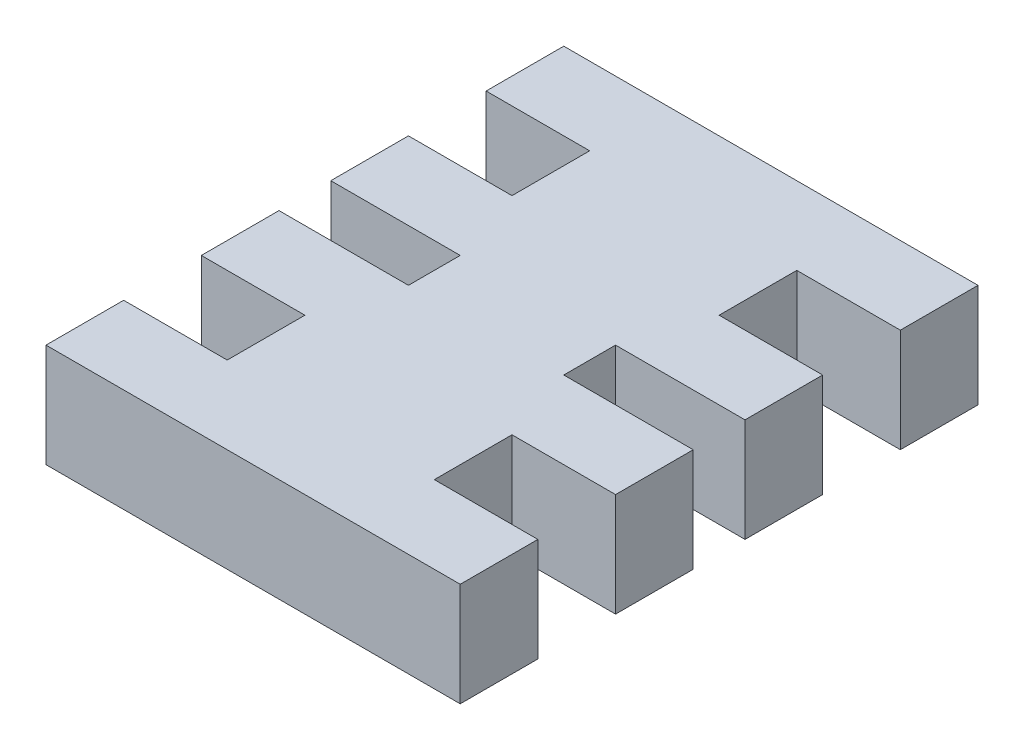
ISO-10303-21;
HEADER;
FILE_DESCRIPTION(('STEP AP214'),'2;1');
FILE_NAME('part.step','',(''),(''),'','','');
FILE_SCHEMA(('AUTOMOTIVE_DESIGN { 1 0 10303 214 1 1 1 1 }'));
ENDSEC;
DATA;
#1=APPLICATION_CONTEXT('core data for automotive mechanical design processes');
#2=APPLICATION_PROTOCOL_DEFINITION('international standard','automotive_design',2000,#1);
#3=PRODUCT_CONTEXT('',#1,'mechanical');
#4=PRODUCT('Part','Part','',(#3));
#5=PRODUCT_RELATED_PRODUCT_CATEGORY('part','',(#4));
#6=PRODUCT_DEFINITION_FORMATION('','',#4);
#7=PRODUCT_DEFINITION_CONTEXT('part definition',#1,'design');
#8=PRODUCT_DEFINITION('design','',#6,#7);
#9=PRODUCT_DEFINITION_SHAPE('','',#8);
#10=(LENGTH_UNIT() NAMED_UNIT(*) SI_UNIT(.MILLI.,.METRE.));
#11=(NAMED_UNIT(*) PLANE_ANGLE_UNIT() SI_UNIT($,.RADIAN.));
#12=(NAMED_UNIT(*) SI_UNIT($,.STERADIAN.) SOLID_ANGLE_UNIT());
#13=UNCERTAINTY_MEASURE_WITH_UNIT(LENGTH_MEASURE(1.E-05),#10,'distance_accuracy_value','');
#14=(GEOMETRIC_REPRESENTATION_CONTEXT(3) GLOBAL_UNCERTAINTY_ASSIGNED_CONTEXT((#13)) GLOBAL_UNIT_ASSIGNED_CONTEXT((#10,
#11,#12)) REPRESENTATION_CONTEXT('',''));
#15=CARTESIAN_POINT('',(0.,0.,0.));
#16=DIRECTION('',(0.,0.,1.));
#17=DIRECTION('',(1.,0.,0.));
#18=AXIS2_PLACEMENT_3D('',#15,#16,#17);
#19=CARTESIAN_POINT('',(40.,20.,35.));
#20=DIRECTION('',(-1.,0.,0.));
#21=DIRECTION('',(0.,0.,1.));
#22=AXIS2_PLACEMENT_3D('',#19,#20,#21);
#23=PLANE('',#22);
#24=DIRECTION('',(0.,0.,-1.));
#25=VECTOR('',#24,1.);
#26=CARTESIAN_POINT('',(40.,0.,35.));
#27=LINE('',#26,#25);
#28=CARTESIAN_POINT('',(40.,0.,50.));
#29=VERTEX_POINT('',#28);
#30=CARTESIAN_POINT('',(40.,0.,35.));
#31=VERTEX_POINT('',#30);
#32=EDGE_CURVE('E260',#29,#31,#27,.T.);
#33=ORIENTED_EDGE('',*,*,#32,.T.);
#34=DIRECTION('',(0.,-1.,0.));
#35=VECTOR('',#34,1.);
#36=CARTESIAN_POINT('',(40.,20.,35.));
#37=LINE('',#36,#35);
#38=CARTESIAN_POINT('',(40.,20.,35.));
#39=VERTEX_POINT('',#38);
#40=EDGE_CURVE('E11',#39,#31,#37,.T.);
#41=ORIENTED_EDGE('',*,*,#40,.F.);
#42=DIRECTION('',(0.,0.,-1.));
#43=VECTOR('',#42,1.);
#44=CARTESIAN_POINT('',(40.,20.,35.));
#45=LINE('',#44,#43);
#46=CARTESIAN_POINT('',(40.,20.,50.));
#47=VERTEX_POINT('',#46);
#48=EDGE_CURVE('E342',#47,#39,#45,.T.);
#49=ORIENTED_EDGE('',*,*,#48,.F.);
#50=DIRECTION('',(0.,-1.,0.));
#51=VECTOR('',#50,1.);
#52=CARTESIAN_POINT('',(40.,20.,50.));
#53=LINE('',#52,#51);
#54=EDGE_CURVE('E256',#47,#29,#53,.T.);
#55=ORIENTED_EDGE('',*,*,#54,.T.);
#56=EDGE_LOOP('',(#33,#41,#49,#55));
#57=FACE_BOUND('',#56,.T.);
#58=ADVANCED_FACE('F39',(#57),#23,.F.);
#59=CARTESIAN_POINT('',(40.,20.,35.));
#60=DIRECTION('',(0.,0.,1.));
#61=DIRECTION('',(1.,0.,0.));
#62=AXIS2_PLACEMENT_3D('',#59,#60,#61);
#63=PLANE('',#62);
#64=DIRECTION('',(-1.,0.,0.));
#65=VECTOR('',#64,1.);
#66=CARTESIAN_POINT('',(40.,0.,35.));
#67=LINE('',#66,#65);
#68=CARTESIAN_POINT('',(20.,0.,35.));
#69=VERTEX_POINT('',#68);
#70=EDGE_CURVE('E264',#31,#69,#67,.T.);
#71=ORIENTED_EDGE('',*,*,#70,.T.);
#72=DIRECTION('',(0.,-1.,0.));
#73=VECTOR('',#72,1.);
#74=CARTESIAN_POINT('',(20.,20.,35.));
#75=LINE('',#74,#73);
#76=CARTESIAN_POINT('',(20.,20.,35.));
#77=VERTEX_POINT('',#76);
#78=EDGE_CURVE('E48',#77,#69,#75,.T.);
#79=ORIENTED_EDGE('',*,*,#78,.F.);
#80=DIRECTION('',(-1.,0.,0.));
#81=VECTOR('',#80,1.);
#82=CARTESIAN_POINT('',(40.,20.,35.));
#83=LINE('',#82,#81);
#84=EDGE_CURVE('E159',#39,#77,#83,.T.);
#85=ORIENTED_EDGE('',*,*,#84,.F.);
#86=ORIENTED_EDGE('',*,*,#40,.T.);
#87=EDGE_LOOP('',(#71,#79,#85,#86));
#88=FACE_BOUND('',#87,.T.);
#89=ADVANCED_FACE('F548',(#88),#63,.F.);
#90=CARTESIAN_POINT('',(20.,20.,35.));
#91=DIRECTION('',(-1.,0.,0.));
#92=DIRECTION('',(0.,0.,1.));
#93=AXIS2_PLACEMENT_3D('',#90,#91,#92);
#94=PLANE('',#93);
#95=DIRECTION('',(0.,0.,-1.));
#96=VECTOR('',#95,1.);
#97=CARTESIAN_POINT('',(20.,0.,35.));
#98=LINE('',#97,#96);
#99=CARTESIAN_POINT('',(20.,0.,20.));
#100=VERTEX_POINT('',#99);
#101=EDGE_CURVE('E267',#69,#100,#98,.T.);
#102=ORIENTED_EDGE('',*,*,#101,.T.);
#103=DIRECTION('',(0.,-1.,0.));
#104=VECTOR('',#103,1.);
#105=CARTESIAN_POINT('',(20.,20.,20.));
#106=LINE('',#105,#104);
#107=CARTESIAN_POINT('',(20.,20.,20.));
#108=VERTEX_POINT('',#107);
#109=EDGE_CURVE('E433',#108,#100,#106,.T.);
#110=ORIENTED_EDGE('',*,*,#109,.F.);
#111=DIRECTION('',(0.,0.,-1.));
#112=VECTOR('',#111,1.);
#113=CARTESIAN_POINT('',(20.,20.,35.));
#114=LINE('',#113,#112);
#115=EDGE_CURVE('E443',#77,#108,#114,.T.);
#116=ORIENTED_EDGE('',*,*,#115,.F.);
#117=ORIENTED_EDGE('',*,*,#78,.T.);
#118=EDGE_LOOP('',(#102,#110,#116,#117));
#119=FACE_BOUND('',#118,.T.);
#120=ADVANCED_FACE('F441',(#119),#94,.F.);
#121=CARTESIAN_POINT('',(40.,20.,20.));
#122=DIRECTION('',(0.,0.,-1.));
#123=DIRECTION('',(-1.,0.,0.));
#124=AXIS2_PLACEMENT_3D('',#121,#122,#123);
#125=PLANE('',#124);
#126=DIRECTION('',(1.,0.,0.));
#127=VECTOR('',#126,1.);
#128=CARTESIAN_POINT('',(40.,0.,20.));
#129=LINE('',#128,#127);
#130=CARTESIAN_POINT('',(40.,0.,20.));
#131=VERTEX_POINT('',#130);
#132=EDGE_CURVE('E270',#100,#131,#129,.T.);
#133=ORIENTED_EDGE('',*,*,#132,.T.);
#134=DIRECTION('',(0.,-1.,0.));
#135=VECTOR('',#134,1.);
#136=CARTESIAN_POINT('',(40.,20.,20.));
#137=LINE('',#136,#135);
#138=CARTESIAN_POINT('',(40.,20.,20.));
#139=VERTEX_POINT('',#138);
#140=EDGE_CURVE('E429',#139,#131,#137,.T.);
#141=ORIENTED_EDGE('',*,*,#140,.F.);
#142=DIRECTION('',(1.,0.,0.));
#143=VECTOR('',#142,1.);
#144=CARTESIAN_POINT('',(40.,20.,20.));
#145=LINE('',#144,#143);
#146=EDGE_CURVE('E462',#108,#139,#145,.T.);
#147=ORIENTED_EDGE('',*,*,#146,.F.);
#148=ORIENTED_EDGE('',*,*,#109,.T.);
#149=EDGE_LOOP('',(#133,#141,#147,#148));
#150=FACE_BOUND('',#149,.T.);
#151=ADVANCED_FACE('F452',(#150),#125,.F.);
#152=CARTESIAN_POINT('',(40.,20.,5.00000000000002));
#153=DIRECTION('',(-1.,0.,0.));
#154=DIRECTION('',(0.,0.,1.));
#155=AXIS2_PLACEMENT_3D('',#152,#153,#154);
#156=PLANE('',#155);
#157=DIRECTION('',(0.,0.,-1.));
#158=VECTOR('',#157,1.);
#159=CARTESIAN_POINT('',(40.,0.,5.00000000000002));
#160=LINE('',#159,#158);
#161=CARTESIAN_POINT('',(40.,0.,5.00000000000002));
#162=VERTEX_POINT('',#161);
#163=EDGE_CURVE('E273',#131,#162,#160,.T.);
#164=ORIENTED_EDGE('',*,*,#163,.T.);
#165=DIRECTION('',(0.,-1.,0.));
#166=VECTOR('',#165,1.);
#167=CARTESIAN_POINT('',(40.,20.,5.00000000000002));
#168=LINE('',#167,#166);
#169=CARTESIAN_POINT('',(40.,20.,5.00000000000002));
#170=VERTEX_POINT('',#169);
#171=EDGE_CURVE('E425',#170,#162,#168,.T.);
#172=ORIENTED_EDGE('',*,*,#171,.F.);
#173=DIRECTION('',(0.,0.,-1.));
#174=VECTOR('',#173,1.);
#175=CARTESIAN_POINT('',(40.,20.,5.00000000000002));
#176=LINE('',#175,#174);
#177=EDGE_CURVE('E458',#139,#170,#176,.T.);
#178=ORIENTED_EDGE('',*,*,#177,.F.);
#179=ORIENTED_EDGE('',*,*,#140,.T.);
#180=EDGE_LOOP('',(#164,#172,#178,#179));
#181=FACE_BOUND('',#180,.T.);
#182=ADVANCED_FACE('F456',(#181),#156,.F.);
#183=CARTESIAN_POINT('',(40.,20.,5.00000000000002));
#184=DIRECTION('',(0.,0.,1.));
#185=DIRECTION('',(1.,0.,0.));
#186=AXIS2_PLACEMENT_3D('',#183,#184,#185);
#187=PLANE('',#186);
#188=DIRECTION('',(-1.,0.,0.));
#189=VECTOR('',#188,1.);
#190=CARTESIAN_POINT('',(40.,0.,5.00000000000002));
#191=LINE('',#190,#189);
#192=CARTESIAN_POINT('',(15.,0.,5.00000000000002));
#193=VERTEX_POINT('',#192);
#194=EDGE_CURVE('E276',#162,#193,#191,.T.);
#195=ORIENTED_EDGE('',*,*,#194,.T.);
#196=DIRECTION('',(0.,-1.,0.));
#197=VECTOR('',#196,1.);
#198=CARTESIAN_POINT('',(15.,20.,5.00000000000002));
#199=LINE('',#198,#197);
#200=CARTESIAN_POINT('',(15.,20.,5.00000000000002));
#201=VERTEX_POINT('',#200);
#202=EDGE_CURVE('E421',#201,#193,#199,.T.);
#203=ORIENTED_EDGE('',*,*,#202,.F.);
#204=DIRECTION('',(-1.,0.,0.));
#205=VECTOR('',#204,1.);
#206=CARTESIAN_POINT('',(40.,20.,5.00000000000002));
#207=LINE('',#206,#205);
#208=EDGE_CURVE('E461',#170,#201,#207,.T.);
#209=ORIENTED_EDGE('',*,*,#208,.F.);
#210=ORIENTED_EDGE('',*,*,#171,.T.);
#211=EDGE_LOOP('',(#195,#203,#209,#210));
#212=FACE_BOUND('',#211,.T.);
#213=ADVANCED_FACE('F561',(#212),#187,.F.);
#214=CARTESIAN_POINT('',(15.,20.,-4.99999999999998));
#215=DIRECTION('',(-1.,0.,0.));
#216=DIRECTION('',(0.,0.,1.));
#217=AXIS2_PLACEMENT_3D('',#214,#215,#216);
#218=PLANE('',#217);
#219=DIRECTION('',(0.,0.,-1.));
#220=VECTOR('',#219,1.);
#221=CARTESIAN_POINT('',(15.,0.,-4.99999999999998));
#222=LINE('',#221,#220);
#223=CARTESIAN_POINT('',(15.,0.,-4.99999999999998));
#224=VERTEX_POINT('',#223);
#225=EDGE_CURVE('E279',#193,#224,#222,.T.);
#226=ORIENTED_EDGE('',*,*,#225,.T.);
#227=DIRECTION('',(0.,-1.,0.));
#228=VECTOR('',#227,1.);
#229=CARTESIAN_POINT('',(15.,20.,-4.99999999999998));
#230=LINE('',#229,#228);
#231=CARTESIAN_POINT('',(15.,20.,-4.99999999999998));
#232=VERTEX_POINT('',#231);
#233=EDGE_CURVE('E417',#232,#224,#230,.T.);
#234=ORIENTED_EDGE('',*,*,#233,.F.);
#235=DIRECTION('',(0.,0.,-1.));
#236=VECTOR('',#235,1.);
#237=CARTESIAN_POINT('',(15.,20.,-4.99999999999998));
#238=LINE('',#237,#236);
#239=EDGE_CURVE('E466',#201,#232,#238,.T.);
#240=ORIENTED_EDGE('',*,*,#239,.F.);
#241=ORIENTED_EDGE('',*,*,#202,.T.);
#242=EDGE_LOOP('',(#226,#234,#240,#241));
#243=FACE_BOUND('',#242,.T.);
#244=ADVANCED_FACE('F564',(#243),#218,.F.);
#245=CARTESIAN_POINT('',(40.,20.,-4.99999999999998));
#246=DIRECTION('',(0.,0.,-1.));
#247=DIRECTION('',(-1.,0.,0.));
#248=AXIS2_PLACEMENT_3D('',#245,#246,#247);
#249=PLANE('',#248);
#250=DIRECTION('',(1.,0.,0.));
#251=VECTOR('',#250,1.);
#252=CARTESIAN_POINT('',(40.,0.,-4.99999999999998));
#253=LINE('',#252,#251);
#254=CARTESIAN_POINT('',(40.,0.,-4.99999999999998));
#255=VERTEX_POINT('',#254);
#256=EDGE_CURVE('E282',#224,#255,#253,.T.);
#257=ORIENTED_EDGE('',*,*,#256,.T.);
#258=DIRECTION('',(0.,-1.,0.));
#259=VECTOR('',#258,1.);
#260=CARTESIAN_POINT('',(40.,20.,-4.99999999999998));
#261=LINE('',#260,#259);
#262=CARTESIAN_POINT('',(40.,20.,-4.99999999999998));
#263=VERTEX_POINT('',#262);
#264=EDGE_CURVE('E413',#263,#255,#261,.T.);
#265=ORIENTED_EDGE('',*,*,#264,.F.);
#266=DIRECTION('',(1.,0.,0.));
#267=VECTOR('',#266,1.);
#268=CARTESIAN_POINT('',(40.,20.,-4.99999999999998));
#269=LINE('',#268,#267);
#270=EDGE_CURVE('E473',#232,#263,#269,.T.);
#271=ORIENTED_EDGE('',*,*,#270,.F.);
#272=ORIENTED_EDGE('',*,*,#233,.T.);
#273=EDGE_LOOP('',(#257,#265,#271,#272));
#274=FACE_BOUND('',#273,.T.);
#275=ADVANCED_FACE('F568',(#274),#249,.F.);
#276=CARTESIAN_POINT('',(40.,20.,-20.));
#277=DIRECTION('',(-1.,0.,0.));
#278=DIRECTION('',(0.,0.,1.));
#279=AXIS2_PLACEMENT_3D('',#276,#277,#278);
#280=PLANE('',#279);
#281=DIRECTION('',(0.,0.,-1.));
#282=VECTOR('',#281,1.);
#283=CARTESIAN_POINT('',(40.,0.,-20.));
#284=LINE('',#283,#282);
#285=CARTESIAN_POINT('',(40.,0.,-20.));
#286=VERTEX_POINT('',#285);
#287=EDGE_CURVE('E285',#255,#286,#284,.T.);
#288=ORIENTED_EDGE('',*,*,#287,.T.);
#289=DIRECTION('',(0.,-1.,0.));
#290=VECTOR('',#289,1.);
#291=CARTESIAN_POINT('',(40.,20.,-20.));
#292=LINE('',#291,#290);
#293=CARTESIAN_POINT('',(40.,20.,-20.));
#294=VERTEX_POINT('',#293);
#295=EDGE_CURVE('E409',#294,#286,#292,.T.);
#296=ORIENTED_EDGE('',*,*,#295,.F.);
#297=DIRECTION('',(0.,0.,-1.));
#298=VECTOR('',#297,1.);
#299=CARTESIAN_POINT('',(40.,20.,-20.));
#300=LINE('',#299,#298);
#301=EDGE_CURVE('E476',#263,#294,#300,.T.);
#302=ORIENTED_EDGE('',*,*,#301,.F.);
#303=ORIENTED_EDGE('',*,*,#264,.T.);
#304=EDGE_LOOP('',(#288,#296,#302,#303));
#305=FACE_BOUND('',#304,.T.);
#306=ADVANCED_FACE('F572',(#305),#280,.F.);
#307=CARTESIAN_POINT('',(40.,20.,-20.));
#308=DIRECTION('',(0.,0.,1.));
#309=DIRECTION('',(1.,0.,0.));
#310=AXIS2_PLACEMENT_3D('',#307,#308,#309);
#311=PLANE('',#310);
#312=DIRECTION('',(-1.,0.,0.));
#313=VECTOR('',#312,1.);
#314=CARTESIAN_POINT('',(40.,0.,-20.));
#315=LINE('',#314,#313);
#316=CARTESIAN_POINT('',(20.,0.,-20.));
#317=VERTEX_POINT('',#316);
#318=EDGE_CURVE('E288',#286,#317,#315,.T.);
#319=ORIENTED_EDGE('',*,*,#318,.T.);
#320=DIRECTION('',(0.,-1.,0.));
#321=VECTOR('',#320,1.);
#322=CARTESIAN_POINT('',(20.,20.,-20.));
#323=LINE('',#322,#321);
#324=CARTESIAN_POINT('',(20.,20.,-20.));
#325=VERTEX_POINT('',#324);
#326=EDGE_CURVE('E405',#325,#317,#323,.T.);
#327=ORIENTED_EDGE('',*,*,#326,.F.);
#328=DIRECTION('',(-1.,0.,0.));
#329=VECTOR('',#328,1.);
#330=CARTESIAN_POINT('',(40.,20.,-20.));
#331=LINE('',#330,#329);
#332=EDGE_CURVE('E479',#294,#325,#331,.T.);
#333=ORIENTED_EDGE('',*,*,#332,.F.);
#334=ORIENTED_EDGE('',*,*,#295,.T.);
#335=EDGE_LOOP('',(#319,#327,#333,#334));
#336=FACE_BOUND('',#335,.T.);
#337=ADVANCED_FACE('F576',(#336),#311,.F.);
#338=CARTESIAN_POINT('',(20.,20.,-35.));
#339=DIRECTION('',(-1.,0.,0.));
#340=DIRECTION('',(0.,0.,1.));
#341=AXIS2_PLACEMENT_3D('',#338,#339,#340);
#342=PLANE('',#341);
#343=DIRECTION('',(0.,0.,-1.));
#344=VECTOR('',#343,1.);
#345=CARTESIAN_POINT('',(20.,0.,-35.));
#346=LINE('',#345,#344);
#347=CARTESIAN_POINT('',(20.,0.,-35.));
#348=VERTEX_POINT('',#347);
#349=EDGE_CURVE('E291',#317,#348,#346,.T.);
#350=ORIENTED_EDGE('',*,*,#349,.T.);
#351=DIRECTION('',(0.,-1.,0.));
#352=VECTOR('',#351,1.);
#353=CARTESIAN_POINT('',(20.,20.,-35.));
#354=LINE('',#353,#352);
#355=CARTESIAN_POINT('',(20.,20.,-35.));
#356=VERTEX_POINT('',#355);
#357=EDGE_CURVE('E401',#356,#348,#354,.T.);
#358=ORIENTED_EDGE('',*,*,#357,.F.);
#359=DIRECTION('',(0.,0.,-1.));
#360=VECTOR('',#359,1.);
#361=CARTESIAN_POINT('',(20.,20.,-35.));
#362=LINE('',#361,#360);
#363=EDGE_CURVE('E482',#325,#356,#362,.T.);
#364=ORIENTED_EDGE('',*,*,#363,.F.);
#365=ORIENTED_EDGE('',*,*,#326,.T.);
#366=EDGE_LOOP('',(#350,#358,#364,#365));
#367=FACE_BOUND('',#366,.T.);
#368=ADVANCED_FACE('F580',(#367),#342,.F.);
#369=CARTESIAN_POINT('',(40.,20.,-35.));
#370=DIRECTION('',(0.,0.,-1.));
#371=DIRECTION('',(-1.,0.,0.));
#372=AXIS2_PLACEMENT_3D('',#369,#370,#371);
#373=PLANE('',#372);
#374=DIRECTION('',(1.,0.,0.));
#375=VECTOR('',#374,1.);
#376=CARTESIAN_POINT('',(40.,0.,-35.));
#377=LINE('',#376,#375);
#378=CARTESIAN_POINT('',(40.,0.,-35.));
#379=VERTEX_POINT('',#378);
#380=EDGE_CURVE('E294',#348,#379,#377,.T.);
#381=ORIENTED_EDGE('',*,*,#380,.T.);
#382=DIRECTION('',(0.,-1.,0.));
#383=VECTOR('',#382,1.);
#384=CARTESIAN_POINT('',(40.,20.,-35.));
#385=LINE('',#384,#383);
#386=CARTESIAN_POINT('',(40.,20.,-35.));
#387=VERTEX_POINT('',#386);
#388=EDGE_CURVE('E397',#387,#379,#385,.T.);
#389=ORIENTED_EDGE('',*,*,#388,.F.);
#390=DIRECTION('',(1.,0.,0.));
#391=VECTOR('',#390,1.);
#392=CARTESIAN_POINT('',(40.,20.,-35.));
#393=LINE('',#392,#391);
#394=EDGE_CURVE('E485',#356,#387,#393,.T.);
#395=ORIENTED_EDGE('',*,*,#394,.F.);
#396=ORIENTED_EDGE('',*,*,#357,.T.);
#397=EDGE_LOOP('',(#381,#389,#395,#396));
#398=FACE_BOUND('',#397,.T.);
#399=ADVANCED_FACE('F584',(#398),#373,.F.);
#400=CARTESIAN_POINT('',(40.,20.,-50.));
#401=DIRECTION('',(-1.,0.,0.));
#402=DIRECTION('',(0.,0.,1.));
#403=AXIS2_PLACEMENT_3D('',#400,#401,#402);
#404=PLANE('',#403);
#405=DIRECTION('',(0.,0.,-1.));
#406=VECTOR('',#405,1.);
#407=CARTESIAN_POINT('',(40.,0.,-50.));
#408=LINE('',#407,#406);
#409=CARTESIAN_POINT('',(40.,0.,-50.));
#410=VERTEX_POINT('',#409);
#411=EDGE_CURVE('E297',#379,#410,#408,.T.);
#412=ORIENTED_EDGE('',*,*,#411,.T.);
#413=DIRECTION('',(0.,-1.,0.));
#414=VECTOR('',#413,1.);
#415=CARTESIAN_POINT('',(40.,20.,-50.));
#416=LINE('',#415,#414);
#417=CARTESIAN_POINT('',(40.,20.,-50.));
#418=VERTEX_POINT('',#417);
#419=EDGE_CURVE('E393',#418,#410,#416,.T.);
#420=ORIENTED_EDGE('',*,*,#419,.F.);
#421=DIRECTION('',(0.,0.,-1.));
#422=VECTOR('',#421,1.);
#423=CARTESIAN_POINT('',(40.,20.,-50.));
#424=LINE('',#423,#422);
#425=EDGE_CURVE('E488',#387,#418,#424,.T.);
#426=ORIENTED_EDGE('',*,*,#425,.F.);
#427=ORIENTED_EDGE('',*,*,#388,.T.);
#428=EDGE_LOOP('',(#412,#420,#426,#427));
#429=FACE_BOUND('',#428,.T.);
#430=ADVANCED_FACE('F588',(#429),#404,.F.);
#431=CARTESIAN_POINT('',(-40.,20.,-50.));
#432=DIRECTION('',(0.,0.,1.));
#433=DIRECTION('',(1.,0.,0.));
#434=AXIS2_PLACEMENT_3D('',#431,#432,#433);
#435=PLANE('',#434);
#436=DIRECTION('',(-1.,0.,0.));
#437=VECTOR('',#436,1.);
#438=CARTESIAN_POINT('',(-40.,0.,-50.));
#439=LINE('',#438,#437);
#440=CARTESIAN_POINT('',(-40.,0.,-50.));
#441=VERTEX_POINT('',#440);
#442=EDGE_CURVE('E300',#410,#441,#439,.T.);
#443=ORIENTED_EDGE('',*,*,#442,.T.);
#444=DIRECTION('',(0.,-1.,0.));
#445=VECTOR('',#444,1.);
#446=CARTESIAN_POINT('',(-40.,20.,-50.));
#447=LINE('',#446,#445);
#448=CARTESIAN_POINT('',(-40.,20.,-50.));
#449=VERTEX_POINT('',#448);
#450=EDGE_CURVE('E389',#449,#441,#447,.T.);
#451=ORIENTED_EDGE('',*,*,#450,.F.);
#452=DIRECTION('',(-1.,0.,0.));
#453=VECTOR('',#452,1.);
#454=CARTESIAN_POINT('',(-40.,20.,-50.));
#455=LINE('',#454,#453);
#456=EDGE_CURVE('E491',#418,#449,#455,.T.);
#457=ORIENTED_EDGE('',*,*,#456,.F.);
#458=ORIENTED_EDGE('',*,*,#419,.T.);
#459=EDGE_LOOP('',(#443,#451,#457,#458));
#460=FACE_BOUND('',#459,.T.);
#461=ADVANCED_FACE('F592',(#460),#435,.F.);
#462=CARTESIAN_POINT('',(-40.,20.,-50.));
#463=DIRECTION('',(1.,0.,0.));
#464=DIRECTION('',(0.,0.,-1.));
#465=AXIS2_PLACEMENT_3D('',#462,#463,#464);
#466=PLANE('',#465);
#467=DIRECTION('',(0.,0.,1.));
#468=VECTOR('',#467,1.);
#469=CARTESIAN_POINT('',(-40.,0.,-50.));
#470=LINE('',#469,#468);
#471=CARTESIAN_POINT('',(-40.,0.,-35.));
#472=VERTEX_POINT('',#471);
#473=EDGE_CURVE('E303',#441,#472,#470,.T.);
#474=ORIENTED_EDGE('',*,*,#473,.T.);
#475=DIRECTION('',(0.,-1.,0.));
#476=VECTOR('',#475,1.);
#477=CARTESIAN_POINT('',(-40.,20.,-35.));
#478=LINE('',#477,#476);
#479=CARTESIAN_POINT('',(-40.,20.,-35.));
#480=VERTEX_POINT('',#479);
#481=EDGE_CURVE('E385',#480,#472,#478,.T.);
#482=ORIENTED_EDGE('',*,*,#481,.F.);
#483=DIRECTION('',(0.,0.,1.));
#484=VECTOR('',#483,1.);
#485=CARTESIAN_POINT('',(-40.,20.,-50.));
#486=LINE('',#485,#484);
#487=EDGE_CURVE('E494',#449,#480,#486,.T.);
#488=ORIENTED_EDGE('',*,*,#487,.F.);
#489=ORIENTED_EDGE('',*,*,#450,.T.);
#490=EDGE_LOOP('',(#474,#482,#488,#489));
#491=FACE_BOUND('',#490,.T.);
#492=ADVANCED_FACE('F596',(#491),#466,.F.);
#493=CARTESIAN_POINT('',(-40.,20.,-35.));
#494=DIRECTION('',(0.,0.,-1.));
#495=DIRECTION('',(-1.,0.,0.));
#496=AXIS2_PLACEMENT_3D('',#493,#494,#495);
#497=PLANE('',#496);
#498=DIRECTION('',(1.,0.,0.));
#499=VECTOR('',#498,1.);
#500=CARTESIAN_POINT('',(-40.,0.,-35.));
#501=LINE('',#500,#499);
#502=CARTESIAN_POINT('',(-20.,0.,-35.));
#503=VERTEX_POINT('',#502);
#504=EDGE_CURVE('E306',#472,#503,#501,.T.);
#505=ORIENTED_EDGE('',*,*,#504,.T.);
#506=DIRECTION('',(0.,-1.,0.));
#507=VECTOR('',#506,1.);
#508=CARTESIAN_POINT('',(-20.,20.,-35.));
#509=LINE('',#508,#507);
#510=CARTESIAN_POINT('',(-20.,20.,-35.));
#511=VERTEX_POINT('',#510);
#512=EDGE_CURVE('E381',#511,#503,#509,.T.);
#513=ORIENTED_EDGE('',*,*,#512,.F.);
#514=DIRECTION('',(1.,0.,0.));
#515=VECTOR('',#514,1.);
#516=CARTESIAN_POINT('',(-40.,20.,-35.));
#517=LINE('',#516,#515);
#518=EDGE_CURVE('E497',#480,#511,#517,.T.);
#519=ORIENTED_EDGE('',*,*,#518,.F.);
#520=ORIENTED_EDGE('',*,*,#481,.T.);
#521=EDGE_LOOP('',(#505,#513,#519,#520));
#522=FACE_BOUND('',#521,.T.);
#523=ADVANCED_FACE('F600',(#522),#497,.F.);
#524=CARTESIAN_POINT('',(-20.,20.,-35.));
#525=DIRECTION('',(1.,0.,0.));
#526=DIRECTION('',(0.,0.,-1.));
#527=AXIS2_PLACEMENT_3D('',#524,#525,#526);
#528=PLANE('',#527);
#529=DIRECTION('',(0.,0.,1.));
#530=VECTOR('',#529,1.);
#531=CARTESIAN_POINT('',(-20.,0.,-35.));
#532=LINE('',#531,#530);
#533=CARTESIAN_POINT('',(-20.,0.,-20.));
#534=VERTEX_POINT('',#533);
#535=EDGE_CURVE('E309',#503,#534,#532,.T.);
#536=ORIENTED_EDGE('',*,*,#535,.T.);
#537=DIRECTION('',(0.,-1.,0.));
#538=VECTOR('',#537,1.);
#539=CARTESIAN_POINT('',(-20.,20.,-20.));
#540=LINE('',#539,#538);
#541=CARTESIAN_POINT('',(-20.,20.,-20.));
#542=VERTEX_POINT('',#541);
#543=EDGE_CURVE('E377',#542,#534,#540,.T.);
#544=ORIENTED_EDGE('',*,*,#543,.F.);
#545=DIRECTION('',(0.,0.,1.));
#546=VECTOR('',#545,1.);
#547=CARTESIAN_POINT('',(-20.,20.,-35.));
#548=LINE('',#547,#546);
#549=EDGE_CURVE('E500',#511,#542,#548,.T.);
#550=ORIENTED_EDGE('',*,*,#549,.F.);
#551=ORIENTED_EDGE('',*,*,#512,.T.);
#552=EDGE_LOOP('',(#536,#544,#550,#551));
#553=FACE_BOUND('',#552,.T.);
#554=ADVANCED_FACE('F604',(#553),#528,.F.);
#555=CARTESIAN_POINT('',(-40.,20.,-20.));
#556=DIRECTION('',(0.,0.,1.));
#557=DIRECTION('',(1.,0.,0.));
#558=AXIS2_PLACEMENT_3D('',#555,#556,#557);
#559=PLANE('',#558);
#560=DIRECTION('',(-1.,0.,0.));
#561=VECTOR('',#560,1.);
#562=CARTESIAN_POINT('',(-40.,0.,-20.));
#563=LINE('',#562,#561);
#564=CARTESIAN_POINT('',(-40.,0.,-20.));
#565=VERTEX_POINT('',#564);
#566=EDGE_CURVE('E312',#534,#565,#563,.T.);
#567=ORIENTED_EDGE('',*,*,#566,.T.);
#568=DIRECTION('',(0.,-1.,0.));
#569=VECTOR('',#568,1.);
#570=CARTESIAN_POINT('',(-40.,20.,-20.));
#571=LINE('',#570,#569);
#572=CARTESIAN_POINT('',(-40.,20.,-20.));
#573=VERTEX_POINT('',#572);
#574=EDGE_CURVE('E373',#573,#565,#571,.T.);
#575=ORIENTED_EDGE('',*,*,#574,.F.);
#576=DIRECTION('',(-1.,0.,0.));
#577=VECTOR('',#576,1.);
#578=CARTESIAN_POINT('',(-40.,20.,-20.));
#579=LINE('',#578,#577);
#580=EDGE_CURVE('E503',#542,#573,#579,.T.);
#581=ORIENTED_EDGE('',*,*,#580,.F.);
#582=ORIENTED_EDGE('',*,*,#543,.T.);
#583=EDGE_LOOP('',(#567,#575,#581,#582));
#584=FACE_BOUND('',#583,.T.);
#585=ADVANCED_FACE('F608',(#584),#559,.F.);
#586=CARTESIAN_POINT('',(-40.,20.,-20.));
#587=DIRECTION('',(1.,0.,0.));
#588=DIRECTION('',(0.,0.,-1.));
#589=AXIS2_PLACEMENT_3D('',#586,#587,#588);
#590=PLANE('',#589);
#591=DIRECTION('',(0.,0.,1.));
#592=VECTOR('',#591,1.);
#593=CARTESIAN_POINT('',(-40.,0.,-20.));
#594=LINE('',#593,#592);
#595=CARTESIAN_POINT('',(-40.,0.,-4.99999999999998));
#596=VERTEX_POINT('',#595);
#597=EDGE_CURVE('E315',#565,#596,#594,.T.);
#598=ORIENTED_EDGE('',*,*,#597,.T.);
#599=DIRECTION('',(0.,-1.,0.));
#600=VECTOR('',#599,1.);
#601=CARTESIAN_POINT('',(-40.,20.,-4.99999999999998));
#602=LINE('',#601,#600);
#603=CARTESIAN_POINT('',(-40.,20.,-4.99999999999998));
#604=VERTEX_POINT('',#603);
#605=EDGE_CURVE('E369',#604,#596,#602,.T.);
#606=ORIENTED_EDGE('',*,*,#605,.F.);
#607=DIRECTION('',(0.,0.,1.));
#608=VECTOR('',#607,1.);
#609=CARTESIAN_POINT('',(-40.,20.,-20.));
#610=LINE('',#609,#608);
#611=EDGE_CURVE('E506',#573,#604,#610,.T.);
#612=ORIENTED_EDGE('',*,*,#611,.F.);
#613=ORIENTED_EDGE('',*,*,#574,.T.);
#614=EDGE_LOOP('',(#598,#606,#612,#613));
#615=FACE_BOUND('',#614,.T.);
#616=ADVANCED_FACE('F612',(#615),#590,.F.);
#617=CARTESIAN_POINT('',(-40.,20.,-4.99999999999998));
#618=DIRECTION('',(0.,0.,-1.));
#619=DIRECTION('',(-1.,0.,0.));
#620=AXIS2_PLACEMENT_3D('',#617,#618,#619);
#621=PLANE('',#620);
#622=DIRECTION('',(1.,0.,0.));
#623=VECTOR('',#622,1.);
#624=CARTESIAN_POINT('',(-40.,0.,-4.99999999999998));
#625=LINE('',#624,#623);
#626=CARTESIAN_POINT('',(-15.,0.,-4.99999999999998));
#627=VERTEX_POINT('',#626);
#628=EDGE_CURVE('E318',#596,#627,#625,.T.);
#629=ORIENTED_EDGE('',*,*,#628,.T.);
#630=DIRECTION('',(0.,-1.,0.));
#631=VECTOR('',#630,1.);
#632=CARTESIAN_POINT('',(-15.,20.,-4.99999999999998));
#633=LINE('',#632,#631);
#634=CARTESIAN_POINT('',(-15.,20.,-4.99999999999998));
#635=VERTEX_POINT('',#634);
#636=EDGE_CURVE('E365',#635,#627,#633,.T.);
#637=ORIENTED_EDGE('',*,*,#636,.F.);
#638=DIRECTION('',(1.,0.,0.));
#639=VECTOR('',#638,1.);
#640=CARTESIAN_POINT('',(-40.,20.,-4.99999999999998));
#641=LINE('',#640,#639);
#642=EDGE_CURVE('E509',#604,#635,#641,.T.);
#643=ORIENTED_EDGE('',*,*,#642,.F.);
#644=ORIENTED_EDGE('',*,*,#605,.T.);
#645=EDGE_LOOP('',(#629,#637,#643,#644));
#646=FACE_BOUND('',#645,.T.);
#647=ADVANCED_FACE('F616',(#646),#621,.F.);
#648=CARTESIAN_POINT('',(-15.,20.,-4.99999999999998));
#649=DIRECTION('',(1.,0.,0.));
#650=DIRECTION('',(0.,0.,-1.));
#651=AXIS2_PLACEMENT_3D('',#648,#649,#650);
#652=PLANE('',#651);
#653=DIRECTION('',(0.,0.,1.));
#654=VECTOR('',#653,1.);
#655=CARTESIAN_POINT('',(-15.,0.,-4.99999999999998));
#656=LINE('',#655,#654);
#657=CARTESIAN_POINT('',(-15.,0.,5.00000000000002));
#658=VERTEX_POINT('',#657);
#659=EDGE_CURVE('E321',#627,#658,#656,.T.);
#660=ORIENTED_EDGE('',*,*,#659,.T.);
#661=DIRECTION('',(0.,-1.,0.));
#662=VECTOR('',#661,1.);
#663=CARTESIAN_POINT('',(-15.,20.,5.00000000000002));
#664=LINE('',#663,#662);
#665=CARTESIAN_POINT('',(-15.,20.,5.00000000000002));
#666=VERTEX_POINT('',#665);
#667=EDGE_CURVE('E361',#666,#658,#664,.T.);
#668=ORIENTED_EDGE('',*,*,#667,.F.);
#669=DIRECTION('',(0.,0.,1.));
#670=VECTOR('',#669,1.);
#671=CARTESIAN_POINT('',(-15.,20.,-4.99999999999998));
#672=LINE('',#671,#670);
#673=EDGE_CURVE('E512',#635,#666,#672,.T.);
#674=ORIENTED_EDGE('',*,*,#673,.F.);
#675=ORIENTED_EDGE('',*,*,#636,.T.);
#676=EDGE_LOOP('',(#660,#668,#674,#675));
#677=FACE_BOUND('',#676,.T.);
#678=ADVANCED_FACE('F620',(#677),#652,.F.);
#679=CARTESIAN_POINT('',(-40.,20.,5.00000000000002));
#680=DIRECTION('',(0.,0.,1.));
#681=DIRECTION('',(1.,0.,0.));
#682=AXIS2_PLACEMENT_3D('',#679,#680,#681);
#683=PLANE('',#682);
#684=DIRECTION('',(-1.,0.,0.));
#685=VECTOR('',#684,1.);
#686=CARTESIAN_POINT('',(-40.,0.,5.00000000000002));
#687=LINE('',#686,#685);
#688=CARTESIAN_POINT('',(-40.,0.,5.00000000000002));
#689=VERTEX_POINT('',#688);
#690=EDGE_CURVE('E324',#658,#689,#687,.T.);
#691=ORIENTED_EDGE('',*,*,#690,.T.);
#692=DIRECTION('',(0.,-1.,0.));
#693=VECTOR('',#692,1.);
#694=CARTESIAN_POINT('',(-40.,20.,5.00000000000002));
#695=LINE('',#694,#693);
#696=CARTESIAN_POINT('',(-40.,20.,5.00000000000002));
#697=VERTEX_POINT('',#696);
#698=EDGE_CURVE('E357',#697,#689,#695,.T.);
#699=ORIENTED_EDGE('',*,*,#698,.F.);
#700=DIRECTION('',(-1.,0.,0.));
#701=VECTOR('',#700,1.);
#702=CARTESIAN_POINT('',(-40.,20.,5.00000000000002));
#703=LINE('',#702,#701);
#704=EDGE_CURVE('E515',#666,#697,#703,.T.);
#705=ORIENTED_EDGE('',*,*,#704,.F.);
#706=ORIENTED_EDGE('',*,*,#667,.T.);
#707=EDGE_LOOP('',(#691,#699,#705,#706));
#708=FACE_BOUND('',#707,.T.);
#709=ADVANCED_FACE('F624',(#708),#683,.F.);
#710=CARTESIAN_POINT('',(-40.,20.,5.00000000000002));
#711=DIRECTION('',(1.,0.,0.));
#712=DIRECTION('',(0.,0.,-1.));
#713=AXIS2_PLACEMENT_3D('',#710,#711,#712);
#714=PLANE('',#713);
#715=DIRECTION('',(0.,0.,1.));
#716=VECTOR('',#715,1.);
#717=CARTESIAN_POINT('',(-40.,0.,5.00000000000002));
#718=LINE('',#717,#716);
#719=CARTESIAN_POINT('',(-40.,0.,20.));
#720=VERTEX_POINT('',#719);
#721=EDGE_CURVE('E327',#689,#720,#718,.T.);
#722=ORIENTED_EDGE('',*,*,#721,.T.);
#723=DIRECTION('',(0.,-1.,0.));
#724=VECTOR('',#723,1.);
#725=CARTESIAN_POINT('',(-40.,20.,20.));
#726=LINE('',#725,#724);
#727=CARTESIAN_POINT('',(-40.,20.,20.));
#728=VERTEX_POINT('',#727);
#729=EDGE_CURVE('E353',#728,#720,#726,.T.);
#730=ORIENTED_EDGE('',*,*,#729,.F.);
#731=DIRECTION('',(0.,0.,1.));
#732=VECTOR('',#731,1.);
#733=CARTESIAN_POINT('',(-40.,20.,5.00000000000002));
#734=LINE('',#733,#732);
#735=EDGE_CURVE('E518',#697,#728,#734,.T.);
#736=ORIENTED_EDGE('',*,*,#735,.F.);
#737=ORIENTED_EDGE('',*,*,#698,.T.);
#738=EDGE_LOOP('',(#722,#730,#736,#737));
#739=FACE_BOUND('',#738,.T.);
#740=ADVANCED_FACE('F628',(#739),#714,.F.);
#741=CARTESIAN_POINT('',(-40.,20.,20.));
#742=DIRECTION('',(0.,0.,-1.));
#743=DIRECTION('',(-1.,0.,0.));
#744=AXIS2_PLACEMENT_3D('',#741,#742,#743);
#745=PLANE('',#744);
#746=DIRECTION('',(1.,0.,0.));
#747=VECTOR('',#746,1.);
#748=CARTESIAN_POINT('',(-40.,0.,20.));
#749=LINE('',#748,#747);
#750=CARTESIAN_POINT('',(-20.,0.,20.));
#751=VERTEX_POINT('',#750);
#752=EDGE_CURVE('E330',#720,#751,#749,.T.);
#753=ORIENTED_EDGE('',*,*,#752,.T.);
#754=DIRECTION('',(0.,-1.,0.));
#755=VECTOR('',#754,1.);
#756=CARTESIAN_POINT('',(-20.,20.,20.));
#757=LINE('',#756,#755);
#758=CARTESIAN_POINT('',(-20.,20.,20.));
#759=VERTEX_POINT('',#758);
#760=EDGE_CURVE('E349',#759,#751,#757,.T.);
#761=ORIENTED_EDGE('',*,*,#760,.F.);
#762=DIRECTION('',(1.,0.,0.));
#763=VECTOR('',#762,1.);
#764=CARTESIAN_POINT('',(-40.,20.,20.));
#765=LINE('',#764,#763);
#766=EDGE_CURVE('E521',#728,#759,#765,.T.);
#767=ORIENTED_EDGE('',*,*,#766,.F.);
#768=ORIENTED_EDGE('',*,*,#729,.T.);
#769=EDGE_LOOP('',(#753,#761,#767,#768));
#770=FACE_BOUND('',#769,.T.);
#771=ADVANCED_FACE('F529',(#770),#745,.F.);
#772=CARTESIAN_POINT('',(-20.,20.,35.));
#773=DIRECTION('',(1.,0.,0.));
#774=DIRECTION('',(0.,0.,-1.));
#775=AXIS2_PLACEMENT_3D('',#772,#773,#774);
#776=PLANE('',#775);
#777=DIRECTION('',(0.,0.,1.));
#778=VECTOR('',#777,1.);
#779=CARTESIAN_POINT('',(-20.,0.,35.));
#780=LINE('',#779,#778);
#781=CARTESIAN_POINT('',(-20.,0.,35.));
#782=VERTEX_POINT('',#781);
#783=EDGE_CURVE('E333',#751,#782,#780,.T.);
#784=ORIENTED_EDGE('',*,*,#783,.T.);
#785=DIRECTION('',(0.,-1.,0.));
#786=VECTOR('',#785,1.);
#787=CARTESIAN_POINT('',(-20.,20.,35.));
#788=LINE('',#787,#786);
#789=CARTESIAN_POINT('',(-20.,20.,35.));
#790=VERTEX_POINT('',#789);
#791=EDGE_CURVE('E249',#790,#782,#788,.T.);
#792=ORIENTED_EDGE('',*,*,#791,.F.);
#793=DIRECTION('',(0.,0.,1.));
#794=VECTOR('',#793,1.);
#795=CARTESIAN_POINT('',(-20.,20.,35.));
#796=LINE('',#795,#794);
#797=EDGE_CURVE('E238',#759,#790,#796,.T.);
#798=ORIENTED_EDGE('',*,*,#797,.F.);
#799=ORIENTED_EDGE('',*,*,#760,.T.);
#800=EDGE_LOOP('',(#784,#792,#798,#799));
#801=FACE_BOUND('',#800,.T.);
#802=ADVANCED_FACE('F533',(#801),#776,.F.);
#803=CARTESIAN_POINT('',(-40.,20.,35.));
#804=DIRECTION('',(0.,0.,1.));
#805=DIRECTION('',(1.,0.,0.));
#806=AXIS2_PLACEMENT_3D('',#803,#804,#805);
#807=PLANE('',#806);
#808=DIRECTION('',(-1.,0.,0.));
#809=VECTOR('',#808,1.);
#810=CARTESIAN_POINT('',(-40.,0.,35.));
#811=LINE('',#810,#809);
#812=CARTESIAN_POINT('',(-40.,0.,35.));
#813=VERTEX_POINT('',#812);
#814=EDGE_CURVE('E247',#782,#813,#811,.T.);
#815=ORIENTED_EDGE('',*,*,#814,.T.);
#816=DIRECTION('',(0.,-1.,0.));
#817=VECTOR('',#816,1.);
#818=CARTESIAN_POINT('',(-40.,20.,35.));
#819=LINE('',#818,#817);
#820=CARTESIAN_POINT('',(-40.,20.,35.));
#821=VERTEX_POINT('',#820);
#822=EDGE_CURVE('E244',#821,#813,#819,.T.);
#823=ORIENTED_EDGE('',*,*,#822,.F.);
#824=DIRECTION('',(-1.,0.,0.));
#825=VECTOR('',#824,1.);
#826=CARTESIAN_POINT('',(-40.,20.,35.));
#827=LINE('',#826,#825);
#828=EDGE_CURVE('E232',#790,#821,#827,.T.);
#829=ORIENTED_EDGE('',*,*,#828,.F.);
#830=ORIENTED_EDGE('',*,*,#791,.T.);
#831=EDGE_LOOP('',(#815,#823,#829,#830));
#832=FACE_BOUND('',#831,.T.);
#833=ADVANCED_FACE('F245',(#832),#807,.F.);
#834=CARTESIAN_POINT('',(-40.,20.,35.));
#835=DIRECTION('',(1.,0.,0.));
#836=DIRECTION('',(0.,0.,-1.));
#837=AXIS2_PLACEMENT_3D('',#834,#835,#836);
#838=PLANE('',#837);
#839=DIRECTION('',(0.,0.,1.));
#840=VECTOR('',#839,1.);
#841=CARTESIAN_POINT('',(-40.,0.,35.));
#842=LINE('',#841,#840);
#843=CARTESIAN_POINT('',(-40.,0.,50.));
#844=VERTEX_POINT('',#843);
#845=EDGE_CURVE('E145',#813,#844,#842,.T.);
#846=ORIENTED_EDGE('',*,*,#845,.T.);
#847=DIRECTION('',(0.,-1.,0.));
#848=VECTOR('',#847,1.);
#849=CARTESIAN_POINT('',(-40.,20.,50.));
#850=LINE('',#849,#848);
#851=CARTESIAN_POINT('',(-40.,20.,50.));
#852=VERTEX_POINT('',#851);
#853=EDGE_CURVE('E250',#852,#844,#850,.T.);
#854=ORIENTED_EDGE('',*,*,#853,.F.);
#855=DIRECTION('',(0.,0.,1.));
#856=VECTOR('',#855,1.);
#857=CARTESIAN_POINT('',(-40.,20.,35.));
#858=LINE('',#857,#856);
#859=EDGE_CURVE('E236',#821,#852,#858,.T.);
#860=ORIENTED_EDGE('',*,*,#859,.F.);
#861=ORIENTED_EDGE('',*,*,#822,.T.);
#862=EDGE_LOOP('',(#846,#854,#860,#861));
#863=FACE_BOUND('',#862,.T.);
#864=ADVANCED_FACE('F252',(#863),#838,.F.);
#865=CARTESIAN_POINT('',(-40.,20.,50.));
#866=DIRECTION('',(0.,0.,-1.));
#867=DIRECTION('',(-1.,0.,0.));
#868=AXIS2_PLACEMENT_3D('',#865,#866,#867);
#869=PLANE('',#868);
#870=DIRECTION('',(1.,0.,0.));
#871=VECTOR('',#870,1.);
#872=CARTESIAN_POINT('',(-40.,0.,50.));
#873=LINE('',#872,#871);
#874=EDGE_CURVE('E151',#844,#29,#873,.T.);
#875=ORIENTED_EDGE('',*,*,#874,.T.);
#876=ORIENTED_EDGE('',*,*,#54,.F.);
#877=DIRECTION('',(1.,0.,0.));
#878=VECTOR('',#877,1.);
#879=CARTESIAN_POINT('',(-40.,20.,50.));
#880=LINE('',#879,#878);
#881=EDGE_CURVE('E56',#852,#47,#880,.T.);
#882=ORIENTED_EDGE('',*,*,#881,.F.);
#883=ORIENTED_EDGE('',*,*,#853,.T.);
#884=EDGE_LOOP('',(#875,#876,#882,#883));
#885=FACE_BOUND('',#884,.T.);
#886=ADVANCED_FACE('F537',(#885),#869,.F.);
#887=CARTESIAN_POINT('',(0.,20.,0.));
#888=DIRECTION('',(0.,1.,0.));
#889=DIRECTION('',(0.,0.,1.));
#890=AXIS2_PLACEMENT_3D('',#887,#888,#889);
#891=PLANE('',#890);
#892=ORIENTED_EDGE('',*,*,#48,.T.);
#893=ORIENTED_EDGE('',*,*,#84,.T.);
#894=ORIENTED_EDGE('',*,*,#115,.T.);
#895=ORIENTED_EDGE('',*,*,#146,.T.);
#896=ORIENTED_EDGE('',*,*,#177,.T.);
#897=ORIENTED_EDGE('',*,*,#208,.T.);
#898=ORIENTED_EDGE('',*,*,#239,.T.);
#899=ORIENTED_EDGE('',*,*,#270,.T.);
#900=ORIENTED_EDGE('',*,*,#301,.T.);
#901=ORIENTED_EDGE('',*,*,#332,.T.);
#902=ORIENTED_EDGE('',*,*,#363,.T.);
#903=ORIENTED_EDGE('',*,*,#394,.T.);
#904=ORIENTED_EDGE('',*,*,#425,.T.);
#905=ORIENTED_EDGE('',*,*,#456,.T.);
#906=ORIENTED_EDGE('',*,*,#487,.T.);
#907=ORIENTED_EDGE('',*,*,#518,.T.);
#908=ORIENTED_EDGE('',*,*,#549,.T.);
#909=ORIENTED_EDGE('',*,*,#580,.T.);
#910=ORIENTED_EDGE('',*,*,#611,.T.);
#911=ORIENTED_EDGE('',*,*,#642,.T.);
#912=ORIENTED_EDGE('',*,*,#673,.T.);
#913=ORIENTED_EDGE('',*,*,#704,.T.);
#914=ORIENTED_EDGE('',*,*,#735,.T.);
#915=ORIENTED_EDGE('',*,*,#766,.T.);
#916=ORIENTED_EDGE('',*,*,#797,.T.);
#917=ORIENTED_EDGE('',*,*,#828,.T.);
#918=ORIENTED_EDGE('',*,*,#859,.T.);
#919=ORIENTED_EDGE('',*,*,#881,.T.);
#920=EDGE_LOOP('',(#892,#893,#894,#895,#896,#897,#898,#899,#900,#901,#902,#903,#904,#905,#906,
#907,#908,#909,#910,#911,#912,#913,#914,#915,#916,#917,#918,#919));
#921=FACE_BOUND('',#920,.T.);
#922=ADVANCED_FACE('F234',(#921),#891,.T.);
#923=CARTESIAN_POINT('',(0.,0.,0.));
#924=DIRECTION('',(0.,1.,0.));
#925=DIRECTION('',(0.,0.,1.));
#926=AXIS2_PLACEMENT_3D('',#923,#924,#925);
#927=PLANE('',#926);
#928=ORIENTED_EDGE('',*,*,#32,.F.);
#929=ORIENTED_EDGE('',*,*,#874,.F.);
#930=ORIENTED_EDGE('',*,*,#845,.F.);
#931=ORIENTED_EDGE('',*,*,#814,.F.);
#932=ORIENTED_EDGE('',*,*,#783,.F.);
#933=ORIENTED_EDGE('',*,*,#752,.F.);
#934=ORIENTED_EDGE('',*,*,#721,.F.);
#935=ORIENTED_EDGE('',*,*,#690,.F.);
#936=ORIENTED_EDGE('',*,*,#659,.F.);
#937=ORIENTED_EDGE('',*,*,#628,.F.);
#938=ORIENTED_EDGE('',*,*,#597,.F.);
#939=ORIENTED_EDGE('',*,*,#566,.F.);
#940=ORIENTED_EDGE('',*,*,#535,.F.);
#941=ORIENTED_EDGE('',*,*,#504,.F.);
#942=ORIENTED_EDGE('',*,*,#473,.F.);
#943=ORIENTED_EDGE('',*,*,#442,.F.);
#944=ORIENTED_EDGE('',*,*,#411,.F.);
#945=ORIENTED_EDGE('',*,*,#380,.F.);
#946=ORIENTED_EDGE('',*,*,#349,.F.);
#947=ORIENTED_EDGE('',*,*,#318,.F.);
#948=ORIENTED_EDGE('',*,*,#287,.F.);
#949=ORIENTED_EDGE('',*,*,#256,.F.);
#950=ORIENTED_EDGE('',*,*,#225,.F.);
#951=ORIENTED_EDGE('',*,*,#194,.F.);
#952=ORIENTED_EDGE('',*,*,#163,.F.);
#953=ORIENTED_EDGE('',*,*,#132,.F.);
#954=ORIENTED_EDGE('',*,*,#101,.F.);
#955=ORIENTED_EDGE('',*,*,#70,.F.);
#956=EDGE_LOOP('',(#928,#929,#930,#931,#932,#933,#934,#935,#936,#937,#938,#939,#940,#941,#942,
#943,#944,#945,#946,#947,#948,#949,#950,#951,#952,#953,#954,#955));
#957=FACE_BOUND('',#956,.T.);
#958=ADVANCED_FACE('F447',(#957),#927,.F.);
#959=CLOSED_SHELL('',(#58,#89,#120,#151,#182,#213,#244,#275,#306,#337,#368,#399,#430,#461,#492,
#523,#554,#585,#616,#647,#678,#709,#740,#771,#802,#833,#864,#886,#922,#958));
#960=MANIFOLD_SOLID_BREP('B2',#959);
#961=ADVANCED_BREP_SHAPE_REPRESENTATION('',(#18,#960),#14);
#962=SHAPE_DEFINITION_REPRESENTATION(#9,#961);
ENDSEC;
END-ISO-10303-21;
